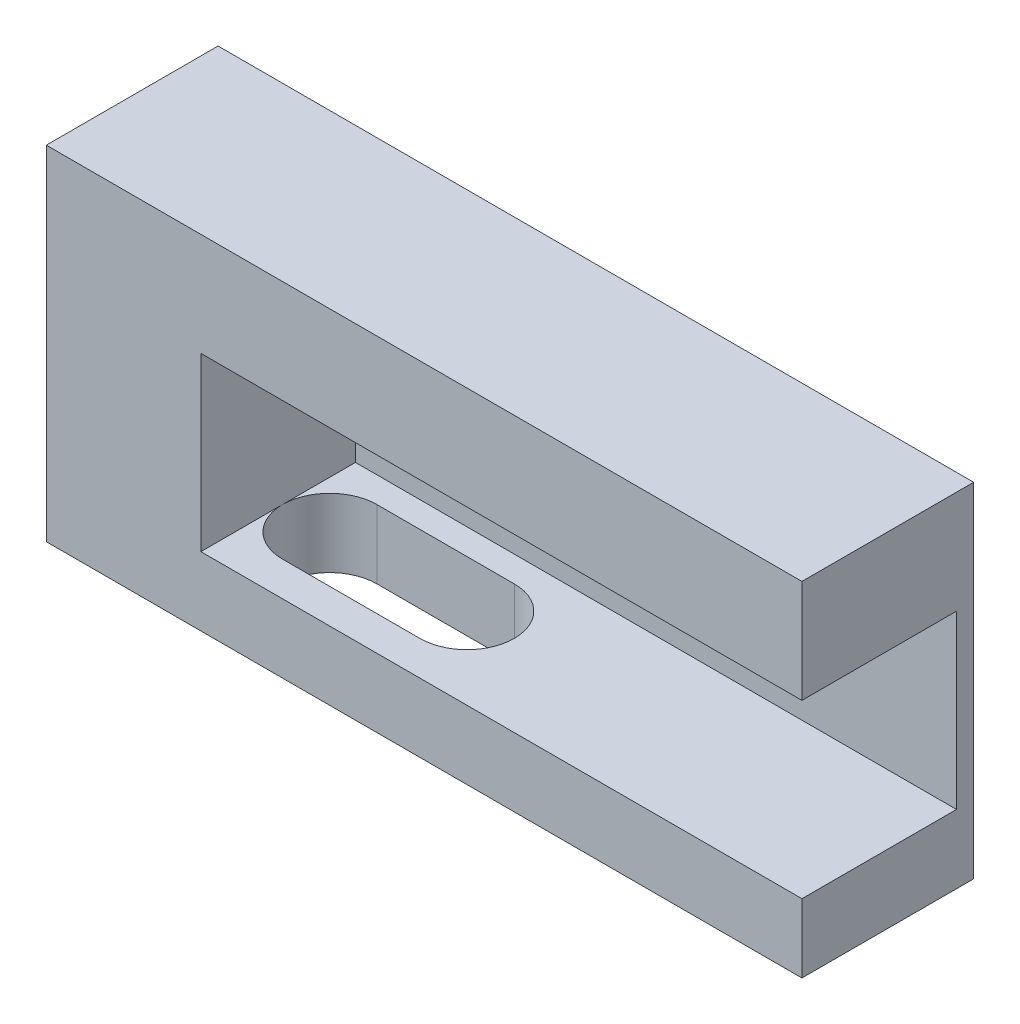
ISO-10303-21;
HEADER;
FILE_DESCRIPTION(('STEP AP214'),'2;1');
FILE_NAME('part.step','',(''),(''),'','','');
FILE_SCHEMA(('AUTOMOTIVE_DESIGN { 1 0 10303 214 1 1 1 1 }'));
ENDSEC;
DATA;
#1=APPLICATION_CONTEXT('core data for automotive mechanical design processes');
#2=APPLICATION_PROTOCOL_DEFINITION('international standard','automotive_design',2000,#1);
#3=PRODUCT_CONTEXT('',#1,'mechanical');
#4=PRODUCT('Part','Part','',(#3));
#5=PRODUCT_RELATED_PRODUCT_CATEGORY('part','',(#4));
#6=PRODUCT_DEFINITION_FORMATION('','',#4);
#7=PRODUCT_DEFINITION_CONTEXT('part definition',#1,'design');
#8=PRODUCT_DEFINITION('design','',#6,#7);
#9=PRODUCT_DEFINITION_SHAPE('','',#8);
#10=(LENGTH_UNIT() NAMED_UNIT(*) SI_UNIT(.MILLI.,.METRE.));
#11=(NAMED_UNIT(*) PLANE_ANGLE_UNIT() SI_UNIT($,.RADIAN.));
#12=(NAMED_UNIT(*) SI_UNIT($,.STERADIAN.) SOLID_ANGLE_UNIT());
#13=UNCERTAINTY_MEASURE_WITH_UNIT(LENGTH_MEASURE(1.E-05),#10,'distance_accuracy_value','');
#14=(GEOMETRIC_REPRESENTATION_CONTEXT(3) GLOBAL_UNCERTAINTY_ASSIGNED_CONTEXT((#13)) GLOBAL_UNIT_ASSIGNED_CONTEXT((#10,
#11,#12)) REPRESENTATION_CONTEXT('',''));
#15=CARTESIAN_POINT('',(0.,0.,0.));
#16=DIRECTION('',(0.,0.,1.));
#17=DIRECTION('',(1.,0.,0.));
#18=AXIS2_PLACEMENT_3D('',#15,#16,#17);
#19=CARTESIAN_POINT('',(44.,0.,5.));
#20=DIRECTION('',(0.,1.,0.));
#21=DIRECTION('',(-1.,0.,0.));
#22=AXIS2_PLACEMENT_3D('',#19,#20,#21);
#23=PLANE('',#22);
#24=DIRECTION('',(1.,0.,0.));
#25=VECTOR('',#24,1.);
#26=CARTESIAN_POINT('',(11.75,0.,2.5));
#27=LINE('',#26,#25);
#28=CARTESIAN_POINT('',(11.75,0.,2.5));
#29=VERTEX_POINT('',#28);
#30=CARTESIAN_POINT('',(19.75,0.,2.5));
#31=VERTEX_POINT('',#30);
#32=EDGE_CURVE('E308',#29,#31,#27,.T.);
#33=ORIENTED_EDGE('',*,*,#32,.F.);
#34=CARTESIAN_POINT('',(11.75,0.,5.25));
#35=DIRECTION('',(0.,-1.,0.));
#36=DIRECTION('',(1.,0.,0.));
#37=AXIS2_PLACEMENT_3D('',#34,#35,#36);
#38=CIRCLE('',#37,2.75);
#39=CARTESIAN_POINT('',(11.75,0.,8.));
#40=VERTEX_POINT('',#39);
#41=EDGE_CURVE('E53',#40,#29,#38,.T.);
#42=ORIENTED_EDGE('',*,*,#41,.F.);
#43=DIRECTION('',(-1.,0.,0.));
#44=VECTOR('',#43,1.);
#45=CARTESIAN_POINT('',(11.75,0.,8.));
#46=LINE('',#45,#44);
#47=CARTESIAN_POINT('',(19.75,0.,8.));
#48=VERTEX_POINT('',#47);
#49=EDGE_CURVE('E189',#48,#40,#46,.T.);
#50=ORIENTED_EDGE('',*,*,#49,.F.);
#51=CARTESIAN_POINT('',(19.75,0.,5.25));
#52=DIRECTION('',(0.,-1.,0.));
#53=DIRECTION('',(1.,0.,0.));
#54=AXIS2_PLACEMENT_3D('',#51,#52,#53);
#55=CIRCLE('',#54,2.75);
#56=EDGE_CURVE('E201',#31,#48,#55,.T.);
#57=ORIENTED_EDGE('',*,*,#56,.F.);
#58=EDGE_LOOP('',(#33,#42,#50,#57));
#59=FACE_BOUND('',#58,.T.);
#60=DIRECTION('',(1.,0.,0.));
#61=VECTOR('',#60,1.);
#62=CARTESIAN_POINT('',(44.,0.,0.));
#63=LINE('',#62,#61);
#64=CARTESIAN_POINT('',(0.,0.,0.));
#65=VERTEX_POINT('',#64);
#66=CARTESIAN_POINT('',(44.,0.,0.));
#67=VERTEX_POINT('',#66);
#68=EDGE_CURVE('E154',#65,#67,#63,.T.);
#69=ORIENTED_EDGE('',*,*,#68,.T.);
#70=DIRECTION('',(0.,0.,-1.));
#71=VECTOR('',#70,1.);
#72=CARTESIAN_POINT('',(44.,0.,5.));
#73=LINE('',#72,#71);
#74=CARTESIAN_POINT('',(44.,0.,10.));
#75=VERTEX_POINT('',#74);
#76=EDGE_CURVE('E164',#75,#67,#73,.T.);
#77=ORIENTED_EDGE('',*,*,#76,.F.);
#78=DIRECTION('',(1.,0.,0.));
#79=VECTOR('',#78,1.);
#80=CARTESIAN_POINT('',(0.,0.,10.));
#81=LINE('',#80,#79);
#82=CARTESIAN_POINT('',(0.,0.,10.));
#83=VERTEX_POINT('',#82);
#84=EDGE_CURVE('E219',#83,#75,#81,.T.);
#85=ORIENTED_EDGE('',*,*,#84,.F.);
#86=DIRECTION('',(0.,0.,-1.));
#87=VECTOR('',#86,1.);
#88=CARTESIAN_POINT('',(0.,0.,5.));
#89=LINE('',#88,#87);
#90=EDGE_CURVE('E156',#83,#65,#89,.T.);
#91=ORIENTED_EDGE('',*,*,#90,.T.);
#92=EDGE_LOOP('',(#69,#77,#85,#91));
#93=FACE_BOUND('',#92,.T.);
#94=ADVANCED_FACE('F38',(#59,#93),#23,.F.);
#95=CARTESIAN_POINT('',(44.,20.,5.));
#96=DIRECTION('',(-1.,0.,0.));
#97=DIRECTION('',(0.,-1.,0.));
#98=AXIS2_PLACEMENT_3D('',#95,#96,#97);
#99=PLANE('',#98);
#100=DIRECTION('',(0.,0.,-1.));
#101=VECTOR('',#100,1.);
#102=CARTESIAN_POINT('',(44.,20.,5.));
#103=LINE('',#102,#101);
#104=CARTESIAN_POINT('',(44.,20.,10.));
#105=VERTEX_POINT('',#104);
#106=CARTESIAN_POINT('',(44.,20.,0.));
#107=VERTEX_POINT('',#106);
#108=EDGE_CURVE('E137',#105,#107,#103,.T.);
#109=ORIENTED_EDGE('',*,*,#108,.F.);
#110=DIRECTION('',(0.,1.,0.));
#111=VECTOR('',#110,1.);
#112=CARTESIAN_POINT('',(44.,14.,10.));
#113=LINE('',#112,#111);
#114=CARTESIAN_POINT('',(44.,14.,10.));
#115=VERTEX_POINT('',#114);
#116=EDGE_CURVE('E191',#115,#105,#113,.T.);
#117=ORIENTED_EDGE('',*,*,#116,.F.);
#118=DIRECTION('',(0.,0.,-1.));
#119=VECTOR('',#118,1.);
#120=CARTESIAN_POINT('',(44.,14.,5.000012));
#121=LINE('',#120,#119);
#122=CARTESIAN_POINT('',(44.,14.,1.));
#123=VERTEX_POINT('',#122);
#124=EDGE_CURVE('E255',#115,#123,#121,.T.);
#125=ORIENTED_EDGE('',*,*,#124,.T.);
#126=DIRECTION('',(0.,-1.,0.));
#127=VECTOR('',#126,1.);
#128=CARTESIAN_POINT('',(44.,14.,1.));
#129=LINE('',#128,#127);
#130=CARTESIAN_POINT('',(44.,4.,1.));
#131=VERTEX_POINT('',#130);
#132=EDGE_CURVE('E243',#123,#131,#129,.T.);
#133=ORIENTED_EDGE('',*,*,#132,.T.);
#134=DIRECTION('',(0.,0.,-1.));
#135=VECTOR('',#134,1.);
#136=CARTESIAN_POINT('',(44.,4.,5.000012));
#137=LINE('',#136,#135);
#138=CARTESIAN_POINT('',(44.,4.,10.));
#139=VERTEX_POINT('',#138);
#140=EDGE_CURVE('E264',#139,#131,#137,.T.);
#141=ORIENTED_EDGE('',*,*,#140,.F.);
#142=DIRECTION('',(0.,1.,0.));
#143=VECTOR('',#142,1.);
#144=CARTESIAN_POINT('',(44.,0.,10.));
#145=LINE('',#144,#143);
#146=EDGE_CURVE('E223',#75,#139,#145,.T.);
#147=ORIENTED_EDGE('',*,*,#146,.F.);
#148=ORIENTED_EDGE('',*,*,#76,.T.);
#149=DIRECTION('',(0.,1.,0.));
#150=VECTOR('',#149,1.);
#151=CARTESIAN_POINT('',(44.,20.,0.));
#152=LINE('',#151,#150);
#153=EDGE_CURVE('E142',#67,#107,#152,.T.);
#154=ORIENTED_EDGE('',*,*,#153,.T.);
#155=EDGE_LOOP('',(#109,#117,#125,#133,#141,#147,#148,#154));
#156=FACE_BOUND('',#155,.T.);
#157=ADVANCED_FACE('F273',(#156),#99,.F.);
#158=CARTESIAN_POINT('',(20.,20.,5.));
#159=DIRECTION('',(0.,-1.,0.));
#160=DIRECTION('',(0.,0.,-1.));
#161=AXIS2_PLACEMENT_3D('',#158,#159,#160);
#162=PLANE('',#161);
#163=DIRECTION('',(-1.,0.,0.));
#164=VECTOR('',#163,1.);
#165=CARTESIAN_POINT('',(20.,20.,0.));
#166=LINE('',#165,#164);
#167=CARTESIAN_POINT('',(0.,20.,0.));
#168=VERTEX_POINT('',#167);
#169=EDGE_CURVE('E131',#107,#168,#166,.T.);
#170=ORIENTED_EDGE('',*,*,#169,.T.);
#171=DIRECTION('',(0.,0.,1.));
#172=VECTOR('',#171,1.);
#173=CARTESIAN_POINT('',(0.,20.,0.));
#174=LINE('',#173,#172);
#175=CARTESIAN_POINT('',(0.,20.,10.));
#176=VERTEX_POINT('',#175);
#177=EDGE_CURVE('E135',#168,#176,#174,.T.);
#178=ORIENTED_EDGE('',*,*,#177,.T.);
#179=DIRECTION('',(-1.,0.,0.));
#180=VECTOR('',#179,1.);
#181=CARTESIAN_POINT('',(44.,20.,10.));
#182=LINE('',#181,#180);
#183=EDGE_CURVE('E214',#105,#176,#182,.T.);
#184=ORIENTED_EDGE('',*,*,#183,.F.);
#185=ORIENTED_EDGE('',*,*,#108,.T.);
#186=EDGE_LOOP('',(#170,#178,#184,#185));
#187=FACE_BOUND('',#186,.T.);
#188=ADVANCED_FACE('F133',(#187),#162,.F.);
#189=CARTESIAN_POINT('',(0.,0.,5.));
#190=DIRECTION('',(1.,0.,0.));
#191=DIRECTION('',(0.,0.,-1.));
#192=AXIS2_PLACEMENT_3D('',#189,#190,#191);
#193=PLANE('',#192);
#194=DIRECTION('',(0.,-1.,0.));
#195=VECTOR('',#194,1.);
#196=CARTESIAN_POINT('',(0.,20.,10.));
#197=LINE('',#196,#195);
#198=EDGE_CURVE('E148',#176,#83,#197,.T.);
#199=ORIENTED_EDGE('',*,*,#198,.F.);
#200=ORIENTED_EDGE('',*,*,#177,.F.);
#201=DIRECTION('',(0.,-1.,0.));
#202=VECTOR('',#201,1.);
#203=CARTESIAN_POINT('',(0.,0.,0.));
#204=LINE('',#203,#202);
#205=EDGE_CURVE('E141',#168,#65,#204,.T.);
#206=ORIENTED_EDGE('',*,*,#205,.T.);
#207=ORIENTED_EDGE('',*,*,#90,.F.);
#208=EDGE_LOOP('',(#199,#200,#206,#207));
#209=FACE_BOUND('',#208,.T.);
#210=ADVANCED_FACE('F145',(#209),#193,.F.);
#211=CARTESIAN_POINT('',(0.,0.,0.));
#212=DIRECTION('',(0.,0.,-1.));
#213=DIRECTION('',(-1.,0.,0.));
#214=AXIS2_PLACEMENT_3D('',#211,#212,#213);
#215=PLANE('',#214);
#216=ORIENTED_EDGE('',*,*,#205,.F.);
#217=ORIENTED_EDGE('',*,*,#169,.F.);
#218=ORIENTED_EDGE('',*,*,#153,.F.);
#219=ORIENTED_EDGE('',*,*,#68,.F.);
#220=EDGE_LOOP('',(#216,#217,#218,#219));
#221=FACE_BOUND('',#220,.T.);
#222=ADVANCED_FACE('F152',(#221),#215,.T.);
#223=CARTESIAN_POINT('',(9.00000000000001,14.,5.000012));
#224=DIRECTION('',(0.,1.,0.));
#225=DIRECTION('',(0.,0.,1.));
#226=AXIS2_PLACEMENT_3D('',#223,#224,#225);
#227=PLANE('',#226);
#228=DIRECTION('',(0.,0.,-1.));
#229=VECTOR('',#228,1.);
#230=CARTESIAN_POINT('',(9.00000000000001,14.,5.000012));
#231=LINE('',#230,#229);
#232=CARTESIAN_POINT('',(9.00000000000001,14.,10.));
#233=VERTEX_POINT('',#232);
#234=CARTESIAN_POINT('',(9.00000000000001,14.,1.));
#235=VERTEX_POINT('',#234);
#236=EDGE_CURVE('E256',#233,#235,#231,.T.);
#237=ORIENTED_EDGE('',*,*,#236,.T.);
#238=DIRECTION('',(1.,0.,0.));
#239=VECTOR('',#238,1.);
#240=CARTESIAN_POINT('',(9.00000000000001,14.,1.));
#241=LINE('',#240,#239);
#242=EDGE_CURVE('E239',#235,#123,#241,.T.);
#243=ORIENTED_EDGE('',*,*,#242,.T.);
#244=ORIENTED_EDGE('',*,*,#124,.F.);
#245=DIRECTION('',(1.,0.,0.));
#246=VECTOR('',#245,1.);
#247=CARTESIAN_POINT('',(9.00000000000001,14.,10.));
#248=LINE('',#247,#246);
#249=EDGE_CURVE('E235',#233,#115,#248,.T.);
#250=ORIENTED_EDGE('',*,*,#249,.F.);
#251=EDGE_LOOP('',(#237,#243,#244,#250));
#252=FACE_BOUND('',#251,.T.);
#253=ADVANCED_FACE('F282',(#252),#227,.F.);
#254=CARTESIAN_POINT('',(9.00000000000001,14.,5.000012));
#255=DIRECTION('',(1.,0.,0.));
#256=DIRECTION('',(0.,0.,-1.));
#257=AXIS2_PLACEMENT_3D('',#254,#255,#256);
#258=PLANE('',#257);
#259=DIRECTION('',(0.,0.,-1.));
#260=VECTOR('',#259,1.);
#261=CARTESIAN_POINT('',(9.00000000000001,4.,5.000012));
#262=LINE('',#261,#260);
#263=CARTESIAN_POINT('',(9.00000000000001,4.,10.));
#264=VERTEX_POINT('',#263);
#265=CARTESIAN_POINT('',(9.00000000000001,4.,5.25));
#266=VERTEX_POINT('',#265);
#267=EDGE_CURVE('E259',#264,#266,#262,.T.);
#268=ORIENTED_EDGE('',*,*,#267,.T.);
#269=CARTESIAN_POINT('',(9.00000000000001,4.,1.));
#270=VERTEX_POINT('',#269);
#271=EDGE_CURVE('E263',#266,#270,#262,.T.);
#272=ORIENTED_EDGE('',*,*,#271,.T.);
#273=DIRECTION('',(0.,-1.,0.));
#274=VECTOR('',#273,1.);
#275=CARTESIAN_POINT('',(9.00000000000001,14.,1.));
#276=LINE('',#275,#274);
#277=EDGE_CURVE('E251',#235,#270,#276,.T.);
#278=ORIENTED_EDGE('',*,*,#277,.F.);
#279=ORIENTED_EDGE('',*,*,#236,.F.);
#280=DIRECTION('',(0.,1.,0.));
#281=VECTOR('',#280,1.);
#282=CARTESIAN_POINT('',(9.00000000000001,4.,10.));
#283=LINE('',#282,#281);
#284=EDGE_CURVE('E231',#264,#233,#283,.T.);
#285=ORIENTED_EDGE('',*,*,#284,.F.);
#286=EDGE_LOOP('',(#268,#272,#278,#279,#285));
#287=FACE_BOUND('',#286,.T.);
#288=ADVANCED_FACE('F288',(#287),#258,.T.);
#289=CARTESIAN_POINT('',(9.00000000000001,4.,5.000012));
#290=DIRECTION('',(0.,1.,0.));
#291=DIRECTION('',(0.,0.,1.));
#292=AXIS2_PLACEMENT_3D('',#289,#290,#291);
#293=PLANE('',#292);
#294=CARTESIAN_POINT('',(11.75,4.,5.25));
#295=DIRECTION('',(0.,1.,0.));
#296=DIRECTION('',(0.,0.,1.));
#297=AXIS2_PLACEMENT_3D('',#294,#295,#296);
#298=CIRCLE('',#297,2.75);
#299=CARTESIAN_POINT('',(11.75,4.,2.5));
#300=VERTEX_POINT('',#299);
#301=EDGE_CURVE('E11',#300,#266,#298,.T.);
#302=ORIENTED_EDGE('',*,*,#301,.F.);
#303=DIRECTION('',(-1.,0.,0.));
#304=VECTOR('',#303,1.);
#305=CARTESIAN_POINT('',(9.00000000000001,4.,2.5));
#306=LINE('',#305,#304);
#307=CARTESIAN_POINT('',(19.75,4.,2.5));
#308=VERTEX_POINT('',#307);
#309=EDGE_CURVE('E168',#308,#300,#306,.T.);
#310=ORIENTED_EDGE('',*,*,#309,.F.);
#311=CARTESIAN_POINT('',(19.75,4.,5.25));
#312=DIRECTION('',(0.,1.,0.));
#313=DIRECTION('',(0.,0.,1.));
#314=AXIS2_PLACEMENT_3D('',#311,#312,#313);
#315=CIRCLE('',#314,2.75);
#316=CARTESIAN_POINT('',(19.75,4.,8.));
#317=VERTEX_POINT('',#316);
#318=EDGE_CURVE('E171',#317,#308,#315,.T.);
#319=ORIENTED_EDGE('',*,*,#318,.F.);
#320=DIRECTION('',(1.,0.,0.));
#321=VECTOR('',#320,1.);
#322=CARTESIAN_POINT('',(9.00000000000001,4.,8.));
#323=LINE('',#322,#321);
#324=CARTESIAN_POINT('',(11.75,4.,8.));
#325=VERTEX_POINT('',#324);
#326=EDGE_CURVE('E173',#325,#317,#323,.T.);
#327=ORIENTED_EDGE('',*,*,#326,.F.);
#328=EDGE_CURVE('E41',#266,#325,#298,.T.);
#329=ORIENTED_EDGE('',*,*,#328,.F.);
#330=ORIENTED_EDGE('',*,*,#267,.F.);
#331=DIRECTION('',(-1.,0.,0.));
#332=VECTOR('',#331,1.);
#333=CARTESIAN_POINT('',(44.,4.,10.));
#334=LINE('',#333,#332);
#335=EDGE_CURVE('E227',#139,#264,#334,.T.);
#336=ORIENTED_EDGE('',*,*,#335,.F.);
#337=ORIENTED_EDGE('',*,*,#140,.T.);
#338=DIRECTION('',(1.,0.,0.));
#339=VECTOR('',#338,1.);
#340=CARTESIAN_POINT('',(9.00000000000001,4.,1.));
#341=LINE('',#340,#339);
#342=EDGE_CURVE('E247',#270,#131,#341,.T.);
#343=ORIENTED_EDGE('',*,*,#342,.F.);
#344=ORIENTED_EDGE('',*,*,#271,.F.);
#345=EDGE_LOOP('',(#302,#310,#319,#327,#329,#330,#336,#337,#343,#344));
#346=FACE_BOUND('',#345,.T.);
#347=ADVANCED_FACE('F195',(#346),#293,.T.);
#348=CARTESIAN_POINT('',(0.,0.,1.));
#349=DIRECTION('',(0.,0.,-1.));
#350=DIRECTION('',(-1.,0.,0.));
#351=AXIS2_PLACEMENT_3D('',#348,#349,#350);
#352=PLANE('',#351);
#353=ORIENTED_EDGE('',*,*,#242,.F.);
#354=ORIENTED_EDGE('',*,*,#277,.T.);
#355=ORIENTED_EDGE('',*,*,#342,.T.);
#356=ORIENTED_EDGE('',*,*,#132,.F.);
#357=EDGE_LOOP('',(#353,#354,#355,#356));
#358=FACE_BOUND('',#357,.T.);
#359=ADVANCED_FACE('F286',(#358),#352,.F.);
#360=CARTESIAN_POINT('',(0.,0.,10.));
#361=DIRECTION('',(0.,0.,1.));
#362=DIRECTION('',(1.,0.,0.));
#363=AXIS2_PLACEMENT_3D('',#360,#361,#362);
#364=PLANE('',#363);
#365=ORIENTED_EDGE('',*,*,#116,.T.);
#366=ORIENTED_EDGE('',*,*,#183,.T.);
#367=ORIENTED_EDGE('',*,*,#198,.T.);
#368=ORIENTED_EDGE('',*,*,#84,.T.);
#369=ORIENTED_EDGE('',*,*,#146,.T.);
#370=ORIENTED_EDGE('',*,*,#335,.T.);
#371=ORIENTED_EDGE('',*,*,#284,.T.);
#372=ORIENTED_EDGE('',*,*,#249,.T.);
#373=EDGE_LOOP('',(#365,#366,#367,#368,#369,#370,#371,#372));
#374=FACE_BOUND('',#373,.T.);
#375=ADVANCED_FACE('F279',(#374),#364,.T.);
#376=CARTESIAN_POINT('',(11.75,5.,5.25));
#377=DIRECTION('',(0.,-1.,0.));
#378=DIRECTION('',(1.,0.,0.));
#379=AXIS2_PLACEMENT_3D('',#376,#377,#378);
#380=CYLINDRICAL_SURFACE('',#379,2.75);
#381=ORIENTED_EDGE('',*,*,#301,.T.);
#382=ORIENTED_EDGE('',*,*,#328,.T.);
#383=DIRECTION('',(0.,-1.,0.));
#384=VECTOR('',#383,1.);
#385=CARTESIAN_POINT('',(11.75,5.,8.));
#386=LINE('',#385,#384);
#387=EDGE_CURVE('E182',#325,#40,#386,.T.);
#388=ORIENTED_EDGE('',*,*,#387,.T.);
#389=ORIENTED_EDGE('',*,*,#41,.T.);
#390=DIRECTION('',(0.,-1.,0.));
#391=VECTOR('',#390,1.);
#392=CARTESIAN_POINT('',(11.75,5.,2.5));
#393=LINE('',#392,#391);
#394=EDGE_CURVE('E205',#300,#29,#393,.T.);
#395=ORIENTED_EDGE('',*,*,#394,.F.);
#396=EDGE_LOOP('',(#381,#382,#388,#389,#395));
#397=FACE_BOUND('',#396,.T.);
#398=ADVANCED_FACE('F181',(#397),#380,.F.);
#399=CARTESIAN_POINT('',(11.75,5.,8.));
#400=DIRECTION('',(0.,0.,1.));
#401=DIRECTION('',(1.,0.,0.));
#402=AXIS2_PLACEMENT_3D('',#399,#400,#401);
#403=PLANE('',#402);
#404=ORIENTED_EDGE('',*,*,#326,.T.);
#405=DIRECTION('',(0.,-1.,0.));
#406=VECTOR('',#405,1.);
#407=CARTESIAN_POINT('',(19.75,5.,8.));
#408=LINE('',#407,#406);
#409=EDGE_CURVE('E192',#317,#48,#408,.T.);
#410=ORIENTED_EDGE('',*,*,#409,.T.);
#411=ORIENTED_EDGE('',*,*,#49,.T.);
#412=ORIENTED_EDGE('',*,*,#387,.F.);
#413=EDGE_LOOP('',(#404,#410,#411,#412));
#414=FACE_BOUND('',#413,.T.);
#415=ADVANCED_FACE('F187',(#414),#403,.F.);
#416=CARTESIAN_POINT('',(19.75,5.,5.25));
#417=DIRECTION('',(0.,-1.,0.));
#418=DIRECTION('',(1.,0.,0.));
#419=AXIS2_PLACEMENT_3D('',#416,#417,#418);
#420=CYLINDRICAL_SURFACE('',#419,2.75);
#421=ORIENTED_EDGE('',*,*,#318,.T.);
#422=DIRECTION('',(0.,-1.,0.));
#423=VECTOR('',#422,1.);
#424=CARTESIAN_POINT('',(19.75,5.,2.5));
#425=LINE('',#424,#423);
#426=EDGE_CURVE('E61',#308,#31,#425,.T.);
#427=ORIENTED_EDGE('',*,*,#426,.T.);
#428=ORIENTED_EDGE('',*,*,#56,.T.);
#429=ORIENTED_EDGE('',*,*,#409,.F.);
#430=EDGE_LOOP('',(#421,#427,#428,#429));
#431=FACE_BOUND('',#430,.T.);
#432=ADVANCED_FACE('F198',(#431),#420,.F.);
#433=CARTESIAN_POINT('',(11.75,5.,2.5));
#434=DIRECTION('',(0.,0.,-1.));
#435=DIRECTION('',(-1.,0.,0.));
#436=AXIS2_PLACEMENT_3D('',#433,#434,#435);
#437=PLANE('',#436);
#438=ORIENTED_EDGE('',*,*,#309,.T.);
#439=ORIENTED_EDGE('',*,*,#394,.T.);
#440=ORIENTED_EDGE('',*,*,#32,.T.);
#441=ORIENTED_EDGE('',*,*,#426,.F.);
#442=EDGE_LOOP('',(#438,#439,#440,#441));
#443=FACE_BOUND('',#442,.T.);
#444=ADVANCED_FACE('F316',(#443),#437,.F.);
#445=CLOSED_SHELL('',(#94,#157,#188,#210,#222,#253,#288,#347,#359,#375,#398,#415,#432,#444));
#446=MANIFOLD_SOLID_BREP('B2',#445);
#447=ADVANCED_BREP_SHAPE_REPRESENTATION('',(#18,#446),#14);
#448=SHAPE_DEFINITION_REPRESENTATION(#9,#447);
ENDSEC;
END-ISO-10303-21;
